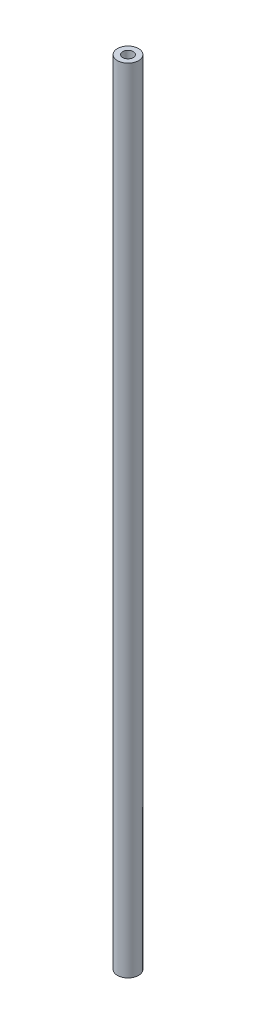
ISO-10303-21;
HEADER;
FILE_DESCRIPTION(('STEP AP214'),'2;1');
FILE_NAME('part.step','',(''),(''),'','','');
FILE_SCHEMA(('AUTOMOTIVE_DESIGN { 1 0 10303 214 1 1 1 1 }'));
ENDSEC;
DATA;
#1=APPLICATION_CONTEXT('core data for automotive mechanical design processes');
#2=APPLICATION_PROTOCOL_DEFINITION('international standard','automotive_design',2000,#1);
#3=PRODUCT_CONTEXT('',#1,'mechanical');
#4=PRODUCT('Part','Part','',(#3));
#5=PRODUCT_RELATED_PRODUCT_CATEGORY('part','',(#4));
#6=PRODUCT_DEFINITION_FORMATION('','',#4);
#7=PRODUCT_DEFINITION_CONTEXT('part definition',#1,'design');
#8=PRODUCT_DEFINITION('design','',#6,#7);
#9=PRODUCT_DEFINITION_SHAPE('','',#8);
#10=(LENGTH_UNIT() NAMED_UNIT(*) SI_UNIT(.MILLI.,.METRE.));
#11=(NAMED_UNIT(*) PLANE_ANGLE_UNIT() SI_UNIT($,.RADIAN.));
#12=(NAMED_UNIT(*) SI_UNIT($,.STERADIAN.) SOLID_ANGLE_UNIT());
#13=UNCERTAINTY_MEASURE_WITH_UNIT(LENGTH_MEASURE(1.E-05),#10,'distance_accuracy_value','');
#14=(GEOMETRIC_REPRESENTATION_CONTEXT(3) GLOBAL_UNCERTAINTY_ASSIGNED_CONTEXT((#13)) GLOBAL_UNIT_ASSIGNED_CONTEXT((#10,
#11,#12)) REPRESENTATION_CONTEXT('',''));
#15=CARTESIAN_POINT('',(0.,0.,0.));
#16=DIRECTION('',(0.,0.,1.));
#17=DIRECTION('',(1.,0.,0.));
#18=AXIS2_PLACEMENT_3D('',#15,#16,#17);
#19=CARTESIAN_POINT('',(0.,527.5,0.));
#20=DIRECTION('',(0.,-1.,0.));
#21=DIRECTION('',(0.,0.,-1.));
#22=AXIS2_PLACEMENT_3D('',#19,#20,#21);
#23=CYLINDRICAL_SURFACE('',#22,7.);
#24=CARTESIAN_POINT('',(0.,527.5,0.));
#25=DIRECTION('',(0.,1.,0.));
#26=DIRECTION('',(0.,0.,1.));
#27=AXIS2_PLACEMENT_3D('',#24,#25,#26);
#28=CIRCLE('',#27,7.);
#29=CARTESIAN_POINT('',(0.,527.5,7.));
#30=VERTEX_POINT('',#29);
#31=EDGE_CURVE('E12',#30,#30,#28,.T.);
#32=ORIENTED_EDGE('',*,*,#31,.F.);
#33=EDGE_LOOP('',(#32));
#34=FACE_BOUND('',#33,.T.);
#35=CARTESIAN_POINT('',(0.,0.,0.));
#36=DIRECTION('',(0.,1.,0.));
#37=DIRECTION('',(0.,0.,1.));
#38=AXIS2_PLACEMENT_3D('',#35,#36,#37);
#39=CIRCLE('',#38,7.);
#40=CARTESIAN_POINT('',(0.,0.,7.));
#41=VERTEX_POINT('',#40);
#42=EDGE_CURVE('E52',#41,#41,#39,.T.);
#43=ORIENTED_EDGE('',*,*,#42,.T.);
#44=EDGE_LOOP('',(#43));
#45=FACE_BOUND('',#44,.T.);
#46=ADVANCED_FACE('F49',(#34,#45),#23,.T.);
#47=CARTESIAN_POINT('',(0.,527.5,0.));
#48=DIRECTION('',(0.,1.,0.));
#49=DIRECTION('',(0.,0.,1.));
#50=AXIS2_PLACEMENT_3D('',#47,#48,#49);
#51=PLANE('',#50);
#52=CARTESIAN_POINT('',(0.,527.5,0.));
#53=DIRECTION('',(0.,1.,0.));
#54=DIRECTION('',(0.,0.,1.));
#55=AXIS2_PLACEMENT_3D('',#52,#53,#54);
#56=CIRCLE('',#55,3.5);
#57=CARTESIAN_POINT('',(0.,527.5,3.5));
#58=VERTEX_POINT('',#57);
#59=EDGE_CURVE('E64',#58,#58,#56,.T.);
#60=ORIENTED_EDGE('',*,*,#59,.F.);
#61=EDGE_LOOP('',(#60));
#62=FACE_BOUND('',#61,.T.);
#63=ORIENTED_EDGE('',*,*,#31,.T.);
#64=EDGE_LOOP('',(#63));
#65=FACE_BOUND('',#64,.T.);
#66=ADVANCED_FACE('F82',(#62,#65),#51,.T.);
#67=CARTESIAN_POINT('',(0.,0.,0.));
#68=DIRECTION('',(0.,1.,0.));
#69=DIRECTION('',(0.,0.,1.));
#70=AXIS2_PLACEMENT_3D('',#67,#68,#69);
#71=PLANE('',#70);
#72=CARTESIAN_POINT('',(0.,0.,0.));
#73=DIRECTION('',(0.,1.,0.));
#74=DIRECTION('',(0.,0.,1.));
#75=AXIS2_PLACEMENT_3D('',#72,#73,#74);
#76=CIRCLE('',#75,3.5);
#77=CARTESIAN_POINT('',(0.,0.,3.5));
#78=VERTEX_POINT('',#77);
#79=EDGE_CURVE('E62',#78,#78,#76,.T.);
#80=ORIENTED_EDGE('',*,*,#79,.T.);
#81=EDGE_LOOP('',(#80));
#82=FACE_BOUND('',#81,.T.);
#83=ORIENTED_EDGE('',*,*,#42,.F.);
#84=EDGE_LOOP('',(#83));
#85=FACE_BOUND('',#84,.T.);
#86=ADVANCED_FACE('F73',(#82,#85),#71,.F.);
#87=CARTESIAN_POINT('',(0.,0.,0.));
#88=DIRECTION('',(0.,1.,0.));
#89=DIRECTION('',(0.,0.,1.));
#90=AXIS2_PLACEMENT_3D('',#87,#88,#89);
#91=CYLINDRICAL_SURFACE('',#90,3.5);
#92=ORIENTED_EDGE('',*,*,#79,.F.);
#93=EDGE_LOOP('',(#92));
#94=FACE_BOUND('',#93,.T.);
#95=ORIENTED_EDGE('',*,*,#59,.T.);
#96=EDGE_LOOP('',(#95));
#97=FACE_BOUND('',#96,.T.);
#98=ADVANCED_FACE('F76',(#94,#97),#91,.F.);
#99=CLOSED_SHELL('',(#46,#66,#86,#98));
#100=MANIFOLD_SOLID_BREP('B2',#99);
#101=ADVANCED_BREP_SHAPE_REPRESENTATION('',(#18,#100),#14);
#102=SHAPE_DEFINITION_REPRESENTATION(#9,#101);
ENDSEC;
END-ISO-10303-21;
